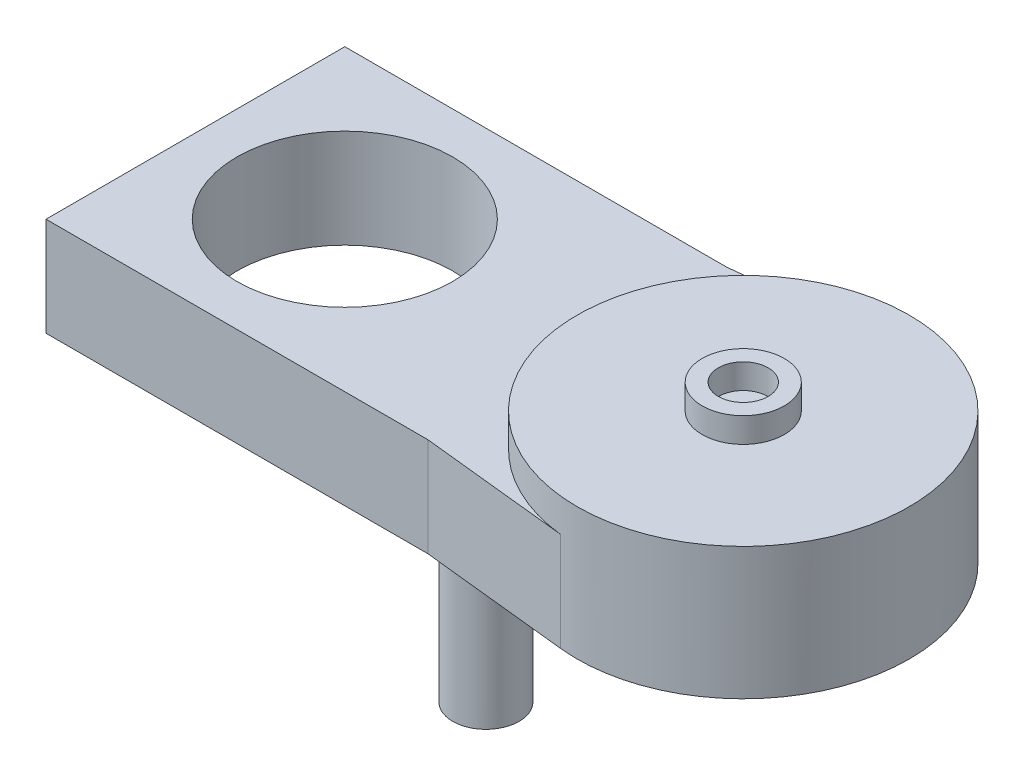
ISO-10303-21;
HEADER;
FILE_DESCRIPTION(('STEP AP214'),'2;1');
FILE_NAME('part.step','',(''),(''),'','','');
FILE_SCHEMA(('AUTOMOTIVE_DESIGN { 1 0 10303 214 1 1 1 1 }'));
ENDSEC;
DATA;
#1=APPLICATION_CONTEXT('core data for automotive mechanical design processes');
#2=APPLICATION_PROTOCOL_DEFINITION('international standard','automotive_design',2000,#1);
#3=PRODUCT_CONTEXT('',#1,'mechanical');
#4=PRODUCT('Part','Part','',(#3));
#5=PRODUCT_RELATED_PRODUCT_CATEGORY('part','',(#4));
#6=PRODUCT_DEFINITION_FORMATION('','',#4);
#7=PRODUCT_DEFINITION_CONTEXT('part definition',#1,'design');
#8=PRODUCT_DEFINITION('design','',#6,#7);
#9=PRODUCT_DEFINITION_SHAPE('','',#8);
#10=(LENGTH_UNIT() NAMED_UNIT(*) SI_UNIT(.MILLI.,.METRE.));
#11=(NAMED_UNIT(*) PLANE_ANGLE_UNIT() SI_UNIT($,.RADIAN.));
#12=(NAMED_UNIT(*) SI_UNIT($,.STERADIAN.) SOLID_ANGLE_UNIT());
#13=UNCERTAINTY_MEASURE_WITH_UNIT(LENGTH_MEASURE(1.E-05),#10,'distance_accuracy_value','');
#14=(GEOMETRIC_REPRESENTATION_CONTEXT(3) GLOBAL_UNCERTAINTY_ASSIGNED_CONTEXT((#13)) GLOBAL_UNIT_ASSIGNED_CONTEXT((#10,
#11,#12)) REPRESENTATION_CONTEXT('',''));
#15=CARTESIAN_POINT('',(0.,0.,0.));
#16=DIRECTION('',(0.,0.,1.));
#17=DIRECTION('',(1.,0.,0.));
#18=AXIS2_PLACEMENT_3D('',#15,#16,#17);
#19=CARTESIAN_POINT('',(24.,5.95,0.));
#20=DIRECTION('',(0.,1.,0.));
#21=DIRECTION('',(0.,0.,1.));
#22=AXIS2_PLACEMENT_3D('',#19,#20,#21);
#23=PLANE('',#22);
#24=CARTESIAN_POINT('',(24.,5.95,0.));
#25=DIRECTION('',(0.,1.,0.));
#26=DIRECTION('',(0.,0.,1.));
#27=AXIS2_PLACEMENT_3D('',#24,#25,#26);
#28=CIRCLE('',#27,10.);
#29=CARTESIAN_POINT('',(22.9502762430939,5.95,-9.94475138121547));
#30=VERTEX_POINT('',#29);
#31=CARTESIAN_POINT('',(22.9502762430939,5.95,9.94475138121547));
#32=VERTEX_POINT('',#31);
#33=EDGE_CURVE('E164',#30,#32,#28,.T.);
#34=ORIENTED_EDGE('',*,*,#33,.F.);
#35=DIRECTION('',(-0.994475138121547,0.,0.104972375690608));
#36=VECTOR('',#35,1.);
#37=CARTESIAN_POINT('',(14.,5.95,-9.));
#38=LINE('',#37,#36);
#39=CARTESIAN_POINT('',(14.,5.95,-9.));
#40=VERTEX_POINT('',#39);
#41=EDGE_CURVE('E50',#30,#40,#38,.T.);
#42=ORIENTED_EDGE('',*,*,#41,.T.);
#43=DIRECTION('',(-1.,0.,0.));
#44=VECTOR('',#43,1.);
#45=CARTESIAN_POINT('',(9.,5.95,-9.));
#46=LINE('',#45,#44);
#47=CARTESIAN_POINT('',(-9.,5.95,-9.));
#48=VERTEX_POINT('',#47);
#49=EDGE_CURVE('E88',#40,#48,#46,.T.);
#50=ORIENTED_EDGE('',*,*,#49,.T.);
#51=DIRECTION('',(0.,0.,1.));
#52=VECTOR('',#51,1.);
#53=CARTESIAN_POINT('',(-9.,5.95,9.));
#54=LINE('',#53,#52);
#55=CARTESIAN_POINT('',(-9.,5.95,9.));
#56=VERTEX_POINT('',#55);
#57=EDGE_CURVE('E101',#48,#56,#54,.T.);
#58=ORIENTED_EDGE('',*,*,#57,.T.);
#59=DIRECTION('',(1.,0.,0.));
#60=VECTOR('',#59,1.);
#61=CARTESIAN_POINT('',(-9.,5.95,9.));
#62=LINE('',#61,#60);
#63=CARTESIAN_POINT('',(14.,5.95,9.));
#64=VERTEX_POINT('',#63);
#65=EDGE_CURVE('E94',#56,#64,#62,.T.);
#66=ORIENTED_EDGE('',*,*,#65,.T.);
#67=DIRECTION('',(0.994475138121547,0.,0.104972375690608));
#68=VECTOR('',#67,1.);
#69=CARTESIAN_POINT('',(14.,5.95,9.));
#70=LINE('',#69,#68);
#71=EDGE_CURVE('E98',#64,#32,#70,.T.);
#72=ORIENTED_EDGE('',*,*,#71,.T.);
#73=EDGE_LOOP('',(#34,#42,#50,#58,#66,#72));
#74=FACE_BOUND('',#73,.T.);
#75=CARTESIAN_POINT('',(0.,5.95,0.));
#76=DIRECTION('',(0.,1.,0.));
#77=DIRECTION('',(0.,0.,1.));
#78=AXIS2_PLACEMENT_3D('',#75,#76,#77);
#79=CIRCLE('',#78,6.5);
#80=CARTESIAN_POINT('',(0.,5.95,6.5));
#81=VERTEX_POINT('',#80);
#82=EDGE_CURVE('E124',#81,#81,#79,.T.);
#83=ORIENTED_EDGE('',*,*,#82,.F.);
#84=EDGE_LOOP('',(#83));
#85=FACE_BOUND('',#84,.T.);
#86=ADVANCED_FACE('F33',(#74,#85),#23,.T.);
#87=CARTESIAN_POINT('',(24.,0.,0.));
#88=DIRECTION('',(0.,1.,0.));
#89=DIRECTION('',(0.,0.,1.));
#90=AXIS2_PLACEMENT_3D('',#87,#88,#89);
#91=PLANE('',#90);
#92=CARTESIAN_POINT('',(13.5,0.,-5.));
#93=DIRECTION('',(0.,1.,0.));
#94=DIRECTION('',(0.,0.,1.));
#95=AXIS2_PLACEMENT_3D('',#92,#93,#94);
#96=CIRCLE('',#95,2.);
#97=CARTESIAN_POINT('',(13.5,0.,-3.));
#98=VERTEX_POINT('',#97);
#99=EDGE_CURVE('E42',#98,#98,#96,.F.);
#100=ORIENTED_EDGE('',*,*,#99,.F.);
#101=EDGE_LOOP('',(#100));
#102=FACE_BOUND('',#101,.T.);
#103=CARTESIAN_POINT('',(13.5,0.,5.));
#104=DIRECTION('',(0.,1.,0.));
#105=DIRECTION('',(0.,0.,1.));
#106=AXIS2_PLACEMENT_3D('',#103,#104,#105);
#107=CIRCLE('',#106,2.);
#108=CARTESIAN_POINT('',(13.5,0.,7.));
#109=VERTEX_POINT('',#108);
#110=EDGE_CURVE('E142',#109,#109,#107,.F.);
#111=ORIENTED_EDGE('',*,*,#110,.F.);
#112=EDGE_LOOP('',(#111));
#113=FACE_BOUND('',#112,.T.);
#114=DIRECTION('',(-1.,0.,0.));
#115=VECTOR('',#114,1.);
#116=CARTESIAN_POINT('',(-9.,0.,-9.));
#117=LINE('',#116,#115);
#118=CARTESIAN_POINT('',(14.,0.,-9.));
#119=VERTEX_POINT('',#118);
#120=CARTESIAN_POINT('',(-9.,0.,-9.));
#121=VERTEX_POINT('',#120);
#122=EDGE_CURVE('E82',#119,#121,#117,.T.);
#123=ORIENTED_EDGE('',*,*,#122,.F.);
#124=DIRECTION('',(-0.994475138121547,0.,0.104972375690608));
#125=VECTOR('',#124,1.);
#126=CARTESIAN_POINT('',(14.,0.,-9.));
#127=LINE('',#126,#125);
#128=CARTESIAN_POINT('',(22.9502762430939,0.,-9.94475138121547));
#129=VERTEX_POINT('',#128);
#130=EDGE_CURVE('E131',#129,#119,#127,.T.);
#131=ORIENTED_EDGE('',*,*,#130,.F.);
#132=CARTESIAN_POINT('',(24.,0.,0.));
#133=DIRECTION('',(0.,1.,0.));
#134=DIRECTION('',(0.,0.,1.));
#135=AXIS2_PLACEMENT_3D('',#132,#133,#134);
#136=CIRCLE('',#135,10.);
#137=CARTESIAN_POINT('',(22.9502762430939,0.,9.94475138121547));
#138=VERTEX_POINT('',#137);
#139=EDGE_CURVE('E75',#138,#129,#136,.T.);
#140=ORIENTED_EDGE('',*,*,#139,.F.);
#141=DIRECTION('',(0.994475138121547,0.,0.104972375690608));
#142=VECTOR('',#141,1.);
#143=CARTESIAN_POINT('',(14.,0.,9.));
#144=LINE('',#143,#142);
#145=CARTESIAN_POINT('',(14.,0.,9.));
#146=VERTEX_POINT('',#145);
#147=EDGE_CURVE('E128',#146,#138,#144,.T.);
#148=ORIENTED_EDGE('',*,*,#147,.F.);
#149=DIRECTION('',(1.,0.,0.));
#150=VECTOR('',#149,1.);
#151=CARTESIAN_POINT('',(9.,0.,9.));
#152=LINE('',#151,#150);
#153=CARTESIAN_POINT('',(-9.,0.,9.));
#154=VERTEX_POINT('',#153);
#155=EDGE_CURVE('E109',#154,#146,#152,.T.);
#156=ORIENTED_EDGE('',*,*,#155,.F.);
#157=DIRECTION('',(0.,0.,1.));
#158=VECTOR('',#157,1.);
#159=CARTESIAN_POINT('',(-9.,0.,9.));
#160=LINE('',#159,#158);
#161=EDGE_CURVE('E123',#121,#154,#160,.T.);
#162=ORIENTED_EDGE('',*,*,#161,.F.);
#163=EDGE_LOOP('',(#123,#131,#140,#148,#156,#162));
#164=FACE_BOUND('',#163,.T.);
#165=CARTESIAN_POINT('',(0.,0.,0.));
#166=DIRECTION('',(0.,1.,0.));
#167=DIRECTION('',(0.,0.,1.));
#168=AXIS2_PLACEMENT_3D('',#165,#166,#167);
#169=CIRCLE('',#168,6.5);
#170=CARTESIAN_POINT('',(0.,0.,6.5));
#171=VERTEX_POINT('',#170);
#172=EDGE_CURVE('E157',#171,#171,#169,.T.);
#173=ORIENTED_EDGE('',*,*,#172,.T.);
#174=EDGE_LOOP('',(#173));
#175=FACE_BOUND('',#174,.T.);
#176=ADVANCED_FACE('F149',(#102,#113,#164,#175),#91,.F.);
#177=CARTESIAN_POINT('',(-9.,5.95,-9.));
#178=DIRECTION('',(0.,0.,1.));
#179=DIRECTION('',(1.,0.,0.));
#180=AXIS2_PLACEMENT_3D('',#177,#178,#179);
#181=PLANE('',#180);
#182=ORIENTED_EDGE('',*,*,#122,.T.);
#183=DIRECTION('',(0.,-1.,0.));
#184=VECTOR('',#183,1.);
#185=CARTESIAN_POINT('',(-9.,5.95,-9.));
#186=LINE('',#185,#184);
#187=EDGE_CURVE('E139',#48,#121,#186,.T.);
#188=ORIENTED_EDGE('',*,*,#187,.F.);
#189=ORIENTED_EDGE('',*,*,#49,.F.);
#190=DIRECTION('',(0.,-1.,0.));
#191=VECTOR('',#190,1.);
#192=CARTESIAN_POINT('',(14.,5.95,-9.));
#193=LINE('',#192,#191);
#194=EDGE_CURVE('E118',#40,#119,#193,.T.);
#195=ORIENTED_EDGE('',*,*,#194,.T.);
#196=EDGE_LOOP('',(#182,#188,#189,#195));
#197=FACE_BOUND('',#196,.T.);
#198=ADVANCED_FACE('F35',(#197),#181,.F.);
#199=CARTESIAN_POINT('',(-9.,5.95,9.));
#200=DIRECTION('',(1.,0.,0.));
#201=DIRECTION('',(0.,0.,-1.));
#202=AXIS2_PLACEMENT_3D('',#199,#200,#201);
#203=PLANE('',#202);
#204=ORIENTED_EDGE('',*,*,#161,.T.);
#205=DIRECTION('',(0.,-1.,0.));
#206=VECTOR('',#205,1.);
#207=CARTESIAN_POINT('',(-9.,5.95,9.));
#208=LINE('',#207,#206);
#209=EDGE_CURVE('E112',#56,#154,#208,.T.);
#210=ORIENTED_EDGE('',*,*,#209,.F.);
#211=ORIENTED_EDGE('',*,*,#57,.F.);
#212=ORIENTED_EDGE('',*,*,#187,.T.);
#213=EDGE_LOOP('',(#204,#210,#211,#212));
#214=FACE_BOUND('',#213,.T.);
#215=ADVANCED_FACE('F221',(#214),#203,.F.);
#216=CARTESIAN_POINT('',(9.,5.95,9.));
#217=DIRECTION('',(0.,0.,-1.));
#218=DIRECTION('',(-1.,0.,0.));
#219=AXIS2_PLACEMENT_3D('',#216,#217,#218);
#220=PLANE('',#219);
#221=ORIENTED_EDGE('',*,*,#155,.T.);
#222=DIRECTION('',(0.,-1.,0.));
#223=VECTOR('',#222,1.);
#224=CARTESIAN_POINT('',(14.,5.95,9.));
#225=LINE('',#224,#223);
#226=EDGE_CURVE('E107',#64,#146,#225,.T.);
#227=ORIENTED_EDGE('',*,*,#226,.F.);
#228=ORIENTED_EDGE('',*,*,#65,.F.);
#229=ORIENTED_EDGE('',*,*,#209,.T.);
#230=EDGE_LOOP('',(#221,#227,#228,#229));
#231=FACE_BOUND('',#230,.T.);
#232=ADVANCED_FACE('F108',(#231),#220,.F.);
#233=CARTESIAN_POINT('',(14.,5.95,9.));
#234=DIRECTION('',(0.104972375690608,0.,-0.994475138121547));
#235=DIRECTION('',(-0.994475138121547,0.,-0.104972375690608));
#236=AXIS2_PLACEMENT_3D('',#233,#234,#235);
#237=PLANE('',#236);
#238=ORIENTED_EDGE('',*,*,#147,.T.);
#239=DIRECTION('',(0.,-1.,0.));
#240=VECTOR('',#239,1.);
#241=CARTESIAN_POINT('',(22.9502762430939,5.95,9.94475138121547));
#242=LINE('',#241,#240);
#243=EDGE_CURVE('E113',#32,#138,#242,.T.);
#244=ORIENTED_EDGE('',*,*,#243,.F.);
#245=ORIENTED_EDGE('',*,*,#71,.F.);
#246=ORIENTED_EDGE('',*,*,#226,.T.);
#247=EDGE_LOOP('',(#238,#244,#245,#246));
#248=FACE_BOUND('',#247,.T.);
#249=ADVANCED_FACE('F115',(#248),#237,.F.);
#250=CARTESIAN_POINT('',(24.,5.95,0.));
#251=DIRECTION('',(0.,-1.,0.));
#252=DIRECTION('',(0.,0.,-1.));
#253=AXIS2_PLACEMENT_3D('',#250,#251,#252);
#254=CYLINDRICAL_SURFACE('',#253,10.);
#255=ORIENTED_EDGE('',*,*,#139,.T.);
#256=DIRECTION('',(0.,-1.,0.));
#257=VECTOR('',#256,1.);
#258=CARTESIAN_POINT('',(22.9502762430939,5.95,-9.94475138121547));
#259=LINE('',#258,#257);
#260=EDGE_CURVE('E135',#30,#129,#259,.T.);
#261=ORIENTED_EDGE('',*,*,#260,.F.);
#262=ORIENTED_EDGE('',*,*,#33,.T.);
#263=ORIENTED_EDGE('',*,*,#243,.T.);
#264=EDGE_LOOP('',(#255,#261,#262,#263));
#265=FACE_BOUND('',#264,.T.);
#266=CARTESIAN_POINT('',(24.,7.95,0.));
#267=DIRECTION('',(0.,1.,0.));
#268=DIRECTION('',(0.,0.,1.));
#269=AXIS2_PLACEMENT_3D('',#266,#267,#268);
#270=CIRCLE('',#269,10.);
#271=CARTESIAN_POINT('',(24.,7.95,10.));
#272=VERTEX_POINT('',#271);
#273=EDGE_CURVE('E159',#272,#272,#270,.T.);
#274=ORIENTED_EDGE('',*,*,#273,.F.);
#275=EDGE_LOOP('',(#274));
#276=FACE_BOUND('',#275,.T.);
#277=ADVANCED_FACE('F214',(#265,#276),#254,.T.);
#278=CARTESIAN_POINT('',(14.,5.95,-9.));
#279=DIRECTION('',(0.104972375690608,0.,0.994475138121547));
#280=DIRECTION('',(0.994475138121547,0.,-0.104972375690608));
#281=AXIS2_PLACEMENT_3D('',#278,#279,#280);
#282=PLANE('',#281);
#283=ORIENTED_EDGE('',*,*,#130,.T.);
#284=ORIENTED_EDGE('',*,*,#194,.F.);
#285=ORIENTED_EDGE('',*,*,#41,.F.);
#286=ORIENTED_EDGE('',*,*,#260,.T.);
#287=EDGE_LOOP('',(#283,#284,#285,#286));
#288=FACE_BOUND('',#287,.T.);
#289=ADVANCED_FACE('F211',(#288),#282,.F.);
#290=CARTESIAN_POINT('',(0.,5.95,0.));
#291=DIRECTION('',(0.,-1.,0.));
#292=DIRECTION('',(0.,0.,-1.));
#293=AXIS2_PLACEMENT_3D('',#290,#291,#292);
#294=CYLINDRICAL_SURFACE('',#293,6.5);
#295=ORIENTED_EDGE('',*,*,#82,.T.);
#296=EDGE_LOOP('',(#295));
#297=FACE_BOUND('',#296,.T.);
#298=ORIENTED_EDGE('',*,*,#172,.F.);
#299=EDGE_LOOP('',(#298));
#300=FACE_BOUND('',#299,.T.);
#301=ADVANCED_FACE('F208',(#297,#300),#294,.F.);
#302=CARTESIAN_POINT('',(24.,7.95,0.));
#303=DIRECTION('',(0.,1.,0.));
#304=DIRECTION('',(0.,0.,1.));
#305=AXIS2_PLACEMENT_3D('',#302,#303,#304);
#306=PLANE('',#305);
#307=CARTESIAN_POINT('',(24.,7.95,0.));
#308=DIRECTION('',(0.,1.,0.));
#309=DIRECTION('',(0.,0.,1.));
#310=AXIS2_PLACEMENT_3D('',#307,#308,#309);
#311=CIRCLE('',#310,2.475);
#312=CARTESIAN_POINT('',(24.,7.95,2.475));
#313=VERTEX_POINT('',#312);
#314=EDGE_CURVE('E176',#313,#313,#311,.T.);
#315=ORIENTED_EDGE('',*,*,#314,.F.);
#316=EDGE_LOOP('',(#315));
#317=FACE_BOUND('',#316,.T.);
#318=ORIENTED_EDGE('',*,*,#273,.T.);
#319=EDGE_LOOP('',(#318));
#320=FACE_BOUND('',#319,.T.);
#321=ADVANCED_FACE('F231',(#317,#320),#306,.T.);
#322=CARTESIAN_POINT('',(13.5,-10.,5.));
#323=DIRECTION('',(0.,1.,0.));
#324=DIRECTION('',(0.,0.,1.));
#325=AXIS2_PLACEMENT_3D('',#322,#323,#324);
#326=CYLINDRICAL_SURFACE('',#325,2.);
#327=CARTESIAN_POINT('',(13.5,-10.,5.));
#328=DIRECTION('',(0.,-1.,0.));
#329=DIRECTION('',(0.,0.,-1.));
#330=AXIS2_PLACEMENT_3D('',#327,#328,#329);
#331=CIRCLE('',#330,2.);
#332=CARTESIAN_POINT('',(13.5,-10.,3.));
#333=VERTEX_POINT('',#332);
#334=EDGE_CURVE('E168',#333,#333,#331,.T.);
#335=ORIENTED_EDGE('',*,*,#334,.F.);
#336=EDGE_LOOP('',(#335));
#337=FACE_BOUND('',#336,.T.);
#338=ORIENTED_EDGE('',*,*,#110,.T.);
#339=EDGE_LOOP('',(#338));
#340=FACE_BOUND('',#339,.T.);
#341=ADVANCED_FACE('F233',(#337,#340),#326,.T.);
#342=CARTESIAN_POINT('',(13.5,-10.,5.));
#343=DIRECTION('',(0.,-1.,0.));
#344=DIRECTION('',(0.,0.,-1.));
#345=AXIS2_PLACEMENT_3D('',#342,#343,#344);
#346=PLANE('',#345);
#347=ORIENTED_EDGE('',*,*,#334,.T.);
#348=EDGE_LOOP('',(#347));
#349=FACE_BOUND('',#348,.T.);
#350=ADVANCED_FACE('F240',(#349),#346,.T.);
#351=CARTESIAN_POINT('',(13.5,-10.,-5.));
#352=DIRECTION('',(0.,1.,0.));
#353=DIRECTION('',(0.,0.,1.));
#354=AXIS2_PLACEMENT_3D('',#351,#352,#353);
#355=CYLINDRICAL_SURFACE('',#354,2.);
#356=CARTESIAN_POINT('',(13.5,-10.,-5.));
#357=DIRECTION('',(0.,-1.,0.));
#358=DIRECTION('',(0.,0.,1.));
#359=AXIS2_PLACEMENT_3D('',#356,#357,#358);
#360=CIRCLE('',#359,2.);
#361=CARTESIAN_POINT('',(13.5,-10.,-3.));
#362=VERTEX_POINT('',#361);
#363=EDGE_CURVE('E172',#362,#362,#360,.T.);
#364=ORIENTED_EDGE('',*,*,#363,.F.);
#365=EDGE_LOOP('',(#364));
#366=FACE_BOUND('',#365,.T.);
#367=ORIENTED_EDGE('',*,*,#99,.T.);
#368=EDGE_LOOP('',(#367));
#369=FACE_BOUND('',#368,.T.);
#370=ADVANCED_FACE('F147',(#366,#369),#355,.T.);
#371=CARTESIAN_POINT('',(13.5,-10.,-5.));
#372=DIRECTION('',(0.,1.,0.));
#373=DIRECTION('',(0.,0.,1.));
#374=AXIS2_PLACEMENT_3D('',#371,#372,#373);
#375=PLANE('',#374);
#376=ORIENTED_EDGE('',*,*,#363,.T.);
#377=EDGE_LOOP('',(#376));
#378=FACE_BOUND('',#377,.T.);
#379=ADVANCED_FACE('F191',(#378),#375,.F.);
#380=CARTESIAN_POINT('',(24.,9.45,0.));
#381=DIRECTION('',(0.,1.,0.));
#382=DIRECTION('',(0.,0.,1.));
#383=AXIS2_PLACEMENT_3D('',#380,#381,#382);
#384=PLANE('',#383);
#385=CARTESIAN_POINT('',(24.,9.45,0.));
#386=DIRECTION('',(0.,1.,0.));
#387=DIRECTION('',(0.,0.,1.));
#388=AXIS2_PLACEMENT_3D('',#385,#386,#387);
#389=CIRCLE('',#388,2.475);
#390=CARTESIAN_POINT('',(24.,9.45,2.475));
#391=VERTEX_POINT('',#390);
#392=EDGE_CURVE('E175',#391,#391,#389,.T.);
#393=ORIENTED_EDGE('',*,*,#392,.T.);
#394=EDGE_LOOP('',(#393));
#395=FACE_BOUND('',#394,.T.);
#396=CARTESIAN_POINT('',(24.,9.45,0.));
#397=DIRECTION('',(0.,1.,0.));
#398=DIRECTION('',(0.,0.,1.));
#399=AXIS2_PLACEMENT_3D('',#396,#397,#398);
#400=CIRCLE('',#399,1.5);
#401=CARTESIAN_POINT('',(24.,9.45,1.5));
#402=VERTEX_POINT('',#401);
#403=EDGE_CURVE('E179',#402,#402,#400,.T.);
#404=ORIENTED_EDGE('',*,*,#403,.F.);
#405=EDGE_LOOP('',(#404));
#406=FACE_BOUND('',#405,.T.);
#407=ADVANCED_FACE('F188',(#395,#406),#384,.T.);
#408=CARTESIAN_POINT('',(24.,9.45,0.));
#409=DIRECTION('',(0.,-1.,0.));
#410=DIRECTION('',(0.,0.,-1.));
#411=AXIS2_PLACEMENT_3D('',#408,#409,#410);
#412=CYLINDRICAL_SURFACE('',#411,2.475);
#413=ORIENTED_EDGE('',*,*,#392,.F.);
#414=EDGE_LOOP('',(#413));
#415=FACE_BOUND('',#414,.T.);
#416=ORIENTED_EDGE('',*,*,#314,.T.);
#417=EDGE_LOOP('',(#416));
#418=FACE_BOUND('',#417,.T.);
#419=ADVANCED_FACE('F190',(#415,#418),#412,.T.);
#420=CARTESIAN_POINT('',(24.,9.45,0.));
#421=DIRECTION('',(0.,-1.,0.));
#422=DIRECTION('',(0.,0.,-1.));
#423=AXIS2_PLACEMENT_3D('',#420,#421,#422);
#424=CYLINDRICAL_SURFACE('',#423,1.5);
#425=ORIENTED_EDGE('',*,*,#403,.T.);
#426=EDGE_LOOP('',(#425));
#427=FACE_BOUND('',#426,.T.);
#428=CARTESIAN_POINT('',(24.,7.95,0.));
#429=DIRECTION('',(0.,1.,0.));
#430=DIRECTION('',(0.,0.,1.));
#431=AXIS2_PLACEMENT_3D('',#428,#429,#430);
#432=CIRCLE('',#431,1.5);
#433=CARTESIAN_POINT('',(24.,7.95,1.5));
#434=VERTEX_POINT('',#433);
#435=EDGE_CURVE('E11',#434,#434,#432,.F.);
#436=ORIENTED_EDGE('',*,*,#435,.T.);
#437=EDGE_LOOP('',(#436));
#438=FACE_BOUND('',#437,.T.);
#439=ADVANCED_FACE('F185',(#427,#438),#424,.F.);
#440=ORIENTED_EDGE('',*,*,#435,.F.);
#441=EDGE_LOOP('',(#440));
#442=FACE_BOUND('',#441,.T.);
#443=ADVANCED_FACE('F235',(#442),#306,.T.);
#444=CLOSED_SHELL('',(#86,#176,#198,#215,#232,#249,#277,#289,#301,#321,#341,#350,#370,#379,#407,
#419,#439,#443));
#445=MANIFOLD_SOLID_BREP('B2',#444);
#446=ADVANCED_BREP_SHAPE_REPRESENTATION('',(#18,#445),#14);
#447=SHAPE_DEFINITION_REPRESENTATION(#9,#446);
ENDSEC;
END-ISO-10303-21;
